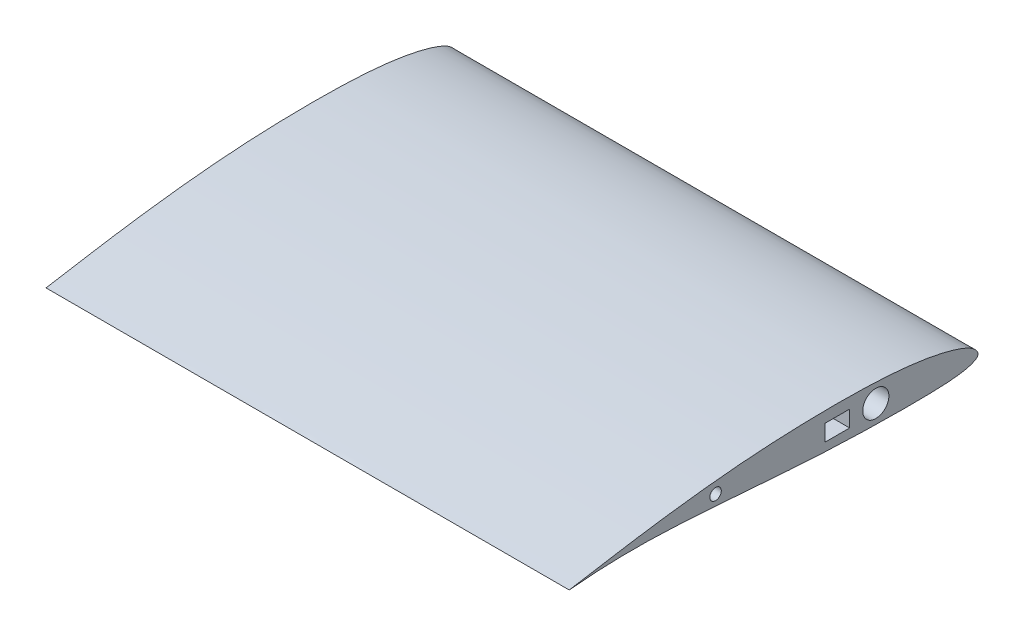
ISO-10303-21;
HEADER;
FILE_DESCRIPTION(('STEP AP214'),'2;1');
FILE_NAME('part.step','',(''),(''),'','','');
FILE_SCHEMA(('AUTOMOTIVE_DESIGN { 1 0 10303 214 1 1 1 1 }'));
ENDSEC;
DATA;
#1=APPLICATION_CONTEXT('core data for automotive mechanical design processes');
#2=APPLICATION_PROTOCOL_DEFINITION('international standard','automotive_design',2000,#1);
#3=PRODUCT_CONTEXT('',#1,'mechanical');
#4=PRODUCT('Part','Part','',(#3));
#5=PRODUCT_RELATED_PRODUCT_CATEGORY('part','',(#4));
#6=PRODUCT_DEFINITION_FORMATION('','',#4);
#7=PRODUCT_DEFINITION_CONTEXT('part definition',#1,'design');
#8=PRODUCT_DEFINITION('design','',#6,#7);
#9=PRODUCT_DEFINITION_SHAPE('','',#8);
#10=(LENGTH_UNIT() NAMED_UNIT(*) SI_UNIT(.MILLI.,.METRE.));
#11=(NAMED_UNIT(*) PLANE_ANGLE_UNIT() SI_UNIT($,.RADIAN.));
#12=(NAMED_UNIT(*) SI_UNIT($,.STERADIAN.) SOLID_ANGLE_UNIT());
#13=UNCERTAINTY_MEASURE_WITH_UNIT(LENGTH_MEASURE(1.E-05),#10,'distance_accuracy_value','');
#14=(GEOMETRIC_REPRESENTATION_CONTEXT(3) GLOBAL_UNCERTAINTY_ASSIGNED_CONTEXT((#13)) GLOBAL_UNIT_ASSIGNED_CONTEXT((#10,
#11,#12)) REPRESENTATION_CONTEXT('',''));
#15=CARTESIAN_POINT('',(0.,0.,0.));
#16=DIRECTION('',(0.,0.,1.));
#17=DIRECTION('',(1.,0.,0.));
#18=AXIS2_PLACEMENT_3D('',#15,#16,#17);
#19=CARTESIAN_POINT('',(320.,1.49711132773622,0.435092083404368));
#20=DIRECTION('',(-1.,0.,0.));
#21=DIRECTION('',(0.,0.,1.));
#22=AXIS2_PLACEMENT_3D('',#19,#20,#21);
#23=PLANE('',#22);
#24=CARTESIAN_POINT('',(320.,6.07732270373844,160.499919709394));
#25=DIRECTION('',(1.,0.,0.));
#26=DIRECTION('',(0.,0.,-1.));
#27=AXIS2_PLACEMENT_3D('',#24,#25,#26);
#28=CIRCLE('',#27,3.49999999999999);
#29=CARTESIAN_POINT('',(320.,6.07732270373844,156.999919709394));
#30=VERTEX_POINT('',#29);
#31=EDGE_CURVE('E148',#30,#30,#28,.T.);
#32=ORIENTED_EDGE('',*,*,#31,.F.);
#33=EDGE_LOOP('',(#32));
#34=FACE_BOUND('',#33,.T.);
#35=CARTESIAN_POINT('',(320.,5.07732270373844,62.4999197093942));
#36=DIRECTION('',(1.,0.,0.));
#37=DIRECTION('',(0.,0.,-1.));
#38=AXIS2_PLACEMENT_3D('',#35,#36,#37);
#39=CIRCLE('',#38,8.);
#40=CARTESIAN_POINT('',(320.,5.07732270373844,54.4999197093942));
#41=VERTEX_POINT('',#40);
#42=EDGE_CURVE('E113',#41,#41,#39,.T.);
#43=ORIENTED_EDGE('',*,*,#42,.F.);
#44=EDGE_LOOP('',(#43));
#45=FACE_BOUND('',#44,.T.);
#46=CARTESIAN_POINT('',(320.,0.,250.));
#47=CARTESIAN_POINT('',(320.,-0.0080427959719715,250.000228293678));
#48=CARTESIAN_POINT('',(320.,0.172375657967406,248.284955515532));
#49=CARTESIAN_POINT('',(320.,0.308690014795419,246.518112419387));
#50=CARTESIAN_POINT('',(320.,0.685693593852336,242.189387343398));
#51=CARTESIAN_POINT('',(320.,1.07410152891603,236.806461263496));
#52=CARTESIAN_POINT('',(320.,1.49731723995003,229.680385951639));
#53=CARTESIAN_POINT('',(320.,1.8232186026768,221.18415869828));
#54=CARTESIAN_POINT('',(320.,1.96762610068065,211.337618207726));
#55=CARTESIAN_POINT('',(320.,1.83322105638369,200.371188527109));
#56=CARTESIAN_POINT('',(320.,1.38960528984164,188.499913622482));
#57=CARTESIAN_POINT('',(320.,0.706014078000893,175.953687417433));
#58=CARTESIAN_POINT('',(320.,-0.160208641561513,162.931424917666));
#59=CARTESIAN_POINT('',(320.,-1.14801632724376,149.615771743617));
#60=CARTESIAN_POINT('',(320.,-2.19092490983926,136.176354994724));
#61=CARTESIAN_POINT('',(320.,-3.21958397917046,122.767140548026));
#62=CARTESIAN_POINT('',(320.,-4.15274312671142,109.520053587455));
#63=CARTESIAN_POINT('',(320.,-4.93856436487493,96.5460959745437));
#64=CARTESIAN_POINT('',(320.,-5.53683070268675,83.9408193016427));
#65=CARTESIAN_POINT('',(320.,-5.94764820461108,71.8018392906514));
#66=CARTESIAN_POINT('',(320.,-6.21845093878312,60.2452560030716));
#67=CARTESIAN_POINT('',(320.,-6.35536975583973,49.3987328907547));
#68=CARTESIAN_POINT('',(320.,-6.38138796281789,39.3972261942655));
#69=CARTESIAN_POINT('',(320.,-6.26504923032313,30.3619348419668));
#70=CARTESIAN_POINT('',(320.,-6.01216491688521,22.4121811031587));
#71=CARTESIAN_POINT('',(320.,-5.59743390072595,15.6262272306516));
#72=CARTESIAN_POINT('',(320.,-4.92870657935606,10.0719075109048));
#73=CARTESIAN_POINT('',(320.,-4.04044698146404,5.69769261214423));
#74=CARTESIAN_POINT('',(320.,-2.8657529844069,2.62532063874475));
#75=CARTESIAN_POINT('',(320.,-1.7115284699546,0.494884225045661));
#76=CARTESIAN_POINT('',(320.,-0.410454230626488,-0.0213125491030087));
#77=CARTESIAN_POINT('',(320.,0.792659826704065,0.0311691995850224));
#78=CARTESIAN_POINT('',(320.,2.30568433693192,0.812599241892923));
#79=CARTESIAN_POINT('',(320.,4.23835242447377,2.72886351673443));
#80=CARTESIAN_POINT('',(320.,6.11817212106947,5.76990724125498));
#81=CARTESIAN_POINT('',(320.,7.91359420170391,9.88094280419771));
#82=CARTESIAN_POINT('',(320.,9.64131817838287,15.0749304677094));
#83=CARTESIAN_POINT('',(320.,11.2838964878058,21.2987522216172));
#84=CARTESIAN_POINT('',(320.,12.7883817585812,28.4971721202648));
#85=CARTESIAN_POINT('',(320.,14.0978349081275,36.6073734062479));
#86=CARTESIAN_POINT('',(320.,15.1594290171638,45.573028440303));
#87=CARTESIAN_POINT('',(320.,15.9609039979753,55.3329100744701));
#88=CARTESIAN_POINT('',(320.,16.4940697383882,65.8165364983871));
#89=CARTESIAN_POINT('',(320.,16.7919897051422,76.9313762604552));
#90=CARTESIAN_POINT('',(320.,16.864754130909,88.5669490281142));
#91=CARTESIAN_POINT('',(320.,16.7267152914356,100.596999885542));
#92=CARTESIAN_POINT('',(320.,16.3833850637257,112.888825982424));
#93=CARTESIAN_POINT('',(320.,15.825573666627,125.31161581915));
#94=CARTESIAN_POINT('',(320.,15.0523318700684,137.743791097076));
#95=CARTESIAN_POINT('',(320.,14.0593390742259,150.072384382085));
#96=CARTESIAN_POINT('',(320.,12.8815869860292,162.191375055682));
#97=CARTESIAN_POINT('',(320.,11.5492803460744,173.989074322246));
#98=CARTESIAN_POINT('',(320.,10.1162497290333,185.35236444642));
#99=CARTESIAN_POINT('',(320.,8.63237912523508,196.163081697706));
#100=CARTESIAN_POINT('',(320.,7.13151388385034,206.300441402258));
#101=CARTESIAN_POINT('',(320.,5.73122176805054,215.560350587015));
#102=CARTESIAN_POINT('',(320.,4.29329512716244,223.97715704258));
#103=CARTESIAN_POINT('',(320.,3.1818088737293,231.363413336396));
#104=CARTESIAN_POINT('',(320.,2.09894241729889,237.746440904332));
#105=CARTESIAN_POINT('',(320.,1.2458619166603,242.622069365861));
#106=CARTESIAN_POINT('',(320.,0.552864946230777,246.64452933247));
#107=CARTESIAN_POINT('',(320.,0.246216764640028,248.328398440367));
#108=CARTESIAN_POINT('',(320.,0.00797737724443801,249.999773563223));
#109=CARTESIAN_POINT('',(320.,0.,250.));
#110=B_SPLINE_CURVE_WITH_KNOTS('',3,(#46,#47,#48,#49,#50,#51,#52,#53,#54,#55,#56,#57,#58,#59,
#60,#61,#62,#63,#64,#65,#66,#67,#68,#69,#70,#71,#72,#73,#74,#75,#76,#77,#78,#79,#80,#81,#82,#83,
#84,#85,#86,#87,#88,#89,#90,#91,#92,#93,#94,#95,#96,#97,#98,#99,#100,#101,#102,#103,#104,#105,
#106,#107,#108,#109),.UNSPECIFIED.,.T.,.F.,(4,1,1,1,1,1,1,1,1,1,1,1,1,1,1,1,1,1,1,1,1,1,1,1,1,1,
1,1,1,1,1,1,1,1,1,1,1,1,1,1,1,1,1,1,1,1,1,1,1,1,1,1,1,1,1,1,1,1,1,1,1,4),(0.,
0.00158888881614516,0.00632921783555629,0.0142024564897436,0.0251728077530557,
0.0391734833267743,0.0560606311759249,0.0755789238487882,0.0973636066296903,0.120926258366677,
0.145825281006277,0.171670911815127,0.198108536705041,0.22479018357162,0.25139057978404,
0.277643490654311,0.303326750051388,0.328257458029316,0.352272548115194,0.375156061746876,
0.396620664402003,0.416422729294005,0.434304420097656,0.450054679859308,0.463465465082325,
0.474478994238096,0.483169222153171,0.489678354497499,0.494104066315722,0.496910015324886,
0.497289784891853,0.501214273282496,0.506457950332762,0.51335695674223,0.522168631834455,
0.53296596992453,0.545689209241574,0.56022077890382,0.57643892310517,0.594258689005965,
0.613600244568652,0.634342385932902,0.656331109263004,0.679351893859712,0.703152302846811,
0.727478208080039,0.7520707394079,0.776691163534608,0.801140183976245,0.825214386971546,
0.848697423570622,0.871352857669295,0.892947448931157,0.913230871058069,0.931955467148994,
0.94834206907442,0.963693004275676,0.976235918239566,0.986320058750392,0.993788799349345,
0.998424034933867,1.),.UNSPECIFIED.);
#111=CARTESIAN_POINT('',(320.,0.,250.));
#112=VERTEX_POINT('',#111);
#113=EDGE_CURVE('E11',#112,#112,#110,.T.);
#114=ORIENTED_EDGE('',*,*,#113,.T.);
#115=EDGE_LOOP('',(#114));
#116=FACE_BOUND('',#115,.T.);
#117=DIRECTION('',(0.,-1.,0.));
#118=VECTOR('',#117,1.);
#119=CARTESIAN_POINT('',(320.,10.0773227037384,93.4999197093942));
#120=LINE('',#119,#118);
#121=CARTESIAN_POINT('',(320.,10.0773227037384,93.4999197093942));
#122=VERTEX_POINT('',#121);
#123=CARTESIAN_POINT('',(320.,0.0773227037384437,93.4999197093942));
#124=VERTEX_POINT('',#123);
#125=EDGE_CURVE('E75',#122,#124,#120,.T.);
#126=ORIENTED_EDGE('',*,*,#125,.F.);
#127=DIRECTION('',(0.,0.,1.));
#128=VECTOR('',#127,1.);
#129=CARTESIAN_POINT('',(320.,10.0773227037384,93.4999197093942));
#130=LINE('',#129,#128);
#131=CARTESIAN_POINT('',(320.,10.0773227037384,78.4999197093942));
#132=VERTEX_POINT('',#131);
#133=EDGE_CURVE('E97',#132,#122,#130,.T.);
#134=ORIENTED_EDGE('',*,*,#133,.F.);
#135=DIRECTION('',(0.,1.,0.));
#136=VECTOR('',#135,1.);
#137=CARTESIAN_POINT('',(320.,10.0773227037384,78.4999197093942));
#138=LINE('',#137,#136);
#139=CARTESIAN_POINT('',(320.,0.0773227037384437,78.4999197093942));
#140=VERTEX_POINT('',#139);
#141=EDGE_CURVE('E95',#140,#132,#138,.T.);
#142=ORIENTED_EDGE('',*,*,#141,.F.);
#143=DIRECTION('',(0.,0.,-1.));
#144=VECTOR('',#143,1.);
#145=CARTESIAN_POINT('',(320.,0.0773227037384437,93.4999197093942));
#146=LINE('',#145,#144);
#147=EDGE_CURVE('E83',#124,#140,#146,.T.);
#148=ORIENTED_EDGE('',*,*,#147,.F.);
#149=EDGE_LOOP('',(#126,#134,#142,#148));
#150=FACE_BOUND('',#149,.T.);
#151=ADVANCED_FACE('F32',(#34,#45,#116,#150),#23,.F.);
#152=CARTESIAN_POINT('',(0.,1.49711132773622,0.435092083404368));
#153=DIRECTION('',(-1.,0.,0.));
#154=DIRECTION('',(0.,0.,1.));
#155=AXIS2_PLACEMENT_3D('',#152,#153,#154);
#156=PLANE('',#155);
#157=CARTESIAN_POINT('',(0.,6.07732270373844,160.499919709394));
#158=DIRECTION('',(-1.,0.,0.));
#159=DIRECTION('',(0.,0.,1.));
#160=AXIS2_PLACEMENT_3D('',#157,#158,#159);
#161=CIRCLE('',#160,3.49999999999999);
#162=CARTESIAN_POINT('',(0.,6.07732270373844,163.999919709394));
#163=VERTEX_POINT('',#162);
#164=EDGE_CURVE('E160',#163,#163,#161,.T.);
#165=ORIENTED_EDGE('',*,*,#164,.F.);
#166=EDGE_LOOP('',(#165));
#167=FACE_BOUND('',#166,.T.);
#168=CARTESIAN_POINT('',(0.,0.,250.));
#169=CARTESIAN_POINT('',(0.,-0.0080427959719715,250.000228293678));
#170=CARTESIAN_POINT('',(0.,0.172375657967406,248.284955515532));
#171=CARTESIAN_POINT('',(0.,0.308690014795419,246.518112419387));
#172=CARTESIAN_POINT('',(0.,0.685693593852336,242.189387343398));
#173=CARTESIAN_POINT('',(0.,1.07410152891603,236.806461263496));
#174=CARTESIAN_POINT('',(0.,1.49731723995003,229.680385951639));
#175=CARTESIAN_POINT('',(0.,1.8232186026768,221.18415869828));
#176=CARTESIAN_POINT('',(0.,1.96762610068065,211.337618207726));
#177=CARTESIAN_POINT('',(0.,1.83322105638369,200.371188527109));
#178=CARTESIAN_POINT('',(0.,1.38960528984164,188.499913622482));
#179=CARTESIAN_POINT('',(0.,0.706014078000893,175.953687417433));
#180=CARTESIAN_POINT('',(0.,-0.160208641561513,162.931424917666));
#181=CARTESIAN_POINT('',(0.,-1.14801632724376,149.615771743617));
#182=CARTESIAN_POINT('',(0.,-2.19092490983926,136.176354994724));
#183=CARTESIAN_POINT('',(0.,-3.21958397917046,122.767140548026));
#184=CARTESIAN_POINT('',(0.,-4.15274312671142,109.520053587455));
#185=CARTESIAN_POINT('',(0.,-4.93856436487493,96.5460959745437));
#186=CARTESIAN_POINT('',(0.,-5.53683070268675,83.9408193016427));
#187=CARTESIAN_POINT('',(0.,-5.94764820461108,71.8018392906514));
#188=CARTESIAN_POINT('',(0.,-6.21845093878312,60.2452560030716));
#189=CARTESIAN_POINT('',(0.,-6.35536975583973,49.3987328907547));
#190=CARTESIAN_POINT('',(0.,-6.38138796281789,39.3972261942655));
#191=CARTESIAN_POINT('',(0.,-6.26504923032313,30.3619348419668));
#192=CARTESIAN_POINT('',(0.,-6.01216491688521,22.4121811031587));
#193=CARTESIAN_POINT('',(0.,-5.59743390072595,15.6262272306516));
#194=CARTESIAN_POINT('',(0.,-4.92870657935606,10.0719075109048));
#195=CARTESIAN_POINT('',(0.,-4.04044698146404,5.69769261214423));
#196=CARTESIAN_POINT('',(0.,-2.8657529844069,2.62532063874475));
#197=CARTESIAN_POINT('',(0.,-1.7115284699546,0.494884225045661));
#198=CARTESIAN_POINT('',(0.,-0.410454230626488,-0.0213125491030087));
#199=CARTESIAN_POINT('',(0.,0.792659826704065,0.0311691995850224));
#200=CARTESIAN_POINT('',(0.,2.30568433693192,0.812599241892923));
#201=CARTESIAN_POINT('',(0.,4.23835242447377,2.72886351673443));
#202=CARTESIAN_POINT('',(0.,6.11817212106947,5.76990724125498));
#203=CARTESIAN_POINT('',(0.,7.91359420170391,9.88094280419771));
#204=CARTESIAN_POINT('',(0.,9.64131817838287,15.0749304677094));
#205=CARTESIAN_POINT('',(0.,11.2838964878058,21.2987522216172));
#206=CARTESIAN_POINT('',(0.,12.7883817585812,28.4971721202648));
#207=CARTESIAN_POINT('',(0.,14.0978349081275,36.6073734062479));
#208=CARTESIAN_POINT('',(0.,15.1594290171638,45.573028440303));
#209=CARTESIAN_POINT('',(0.,15.9609039979753,55.3329100744701));
#210=CARTESIAN_POINT('',(0.,16.4940697383882,65.8165364983871));
#211=CARTESIAN_POINT('',(0.,16.7919897051422,76.9313762604552));
#212=CARTESIAN_POINT('',(0.,16.864754130909,88.5669490281142));
#213=CARTESIAN_POINT('',(0.,16.7267152914356,100.596999885542));
#214=CARTESIAN_POINT('',(0.,16.3833850637257,112.888825982424));
#215=CARTESIAN_POINT('',(0.,15.825573666627,125.31161581915));
#216=CARTESIAN_POINT('',(0.,15.0523318700684,137.743791097076));
#217=CARTESIAN_POINT('',(0.,14.0593390742259,150.072384382085));
#218=CARTESIAN_POINT('',(0.,12.8815869860292,162.191375055682));
#219=CARTESIAN_POINT('',(0.,11.5492803460744,173.989074322246));
#220=CARTESIAN_POINT('',(0.,10.1162497290333,185.35236444642));
#221=CARTESIAN_POINT('',(0.,8.63237912523508,196.163081697706));
#222=CARTESIAN_POINT('',(0.,7.13151388385034,206.300441402258));
#223=CARTESIAN_POINT('',(0.,5.73122176805054,215.560350587015));
#224=CARTESIAN_POINT('',(0.,4.29329512716244,223.97715704258));
#225=CARTESIAN_POINT('',(0.,3.1818088737293,231.363413336396));
#226=CARTESIAN_POINT('',(0.,2.09894241729889,237.746440904332));
#227=CARTESIAN_POINT('',(0.,1.2458619166603,242.622069365861));
#228=CARTESIAN_POINT('',(0.,0.552864946230777,246.64452933247));
#229=CARTESIAN_POINT('',(0.,0.246216764640028,248.328398440367));
#230=CARTESIAN_POINT('',(0.,0.00797737724443801,249.999773563223));
#231=CARTESIAN_POINT('',(0.,0.,250.));
#232=B_SPLINE_CURVE_WITH_KNOTS('',3,(#168,#169,#170,#171,#172,#173,#174,#175,#176,#177,#178,
#179,#180,#181,#182,#183,#184,#185,#186,#187,#188,#189,#190,#191,#192,#193,#194,#195,#196,#197,
#198,#199,#200,#201,#202,#203,#204,#205,#206,#207,#208,#209,#210,#211,#212,#213,#214,#215,#216,
#217,#218,#219,#220,#221,#222,#223,#224,#225,#226,#227,#228,#229,#230,#231),.UNSPECIFIED.,.T.,
.F.,(4,1,1,1,1,1,1,1,1,1,1,1,1,1,1,1,1,1,1,1,1,1,1,1,1,1,1,1,1,1,1,1,1,1,1,1,1,1,1,1,1,1,1,1,1,
1,1,1,1,1,1,1,1,1,1,1,1,1,1,1,1,4),(0.,0.00158888881614516,0.00632921783555629,
0.0142024564897436,0.0251728077530557,0.0391734833267743,0.0560606311759249,0.0755789238487882,
0.0973636066296903,0.120926258366677,0.145825281006277,0.171670911815127,0.198108536705041,
0.22479018357162,0.25139057978404,0.277643490654311,0.303326750051388,0.328257458029316,
0.352272548115194,0.375156061746876,0.396620664402003,0.416422729294005,0.434304420097656,
0.450054679859308,0.463465465082325,0.474478994238096,0.483169222153171,0.489678354497499,
0.494104066315722,0.496910015324886,0.497289784891853,0.501214273282496,0.506457950332762,
0.51335695674223,0.522168631834455,0.53296596992453,0.545689209241574,0.56022077890382,
0.57643892310517,0.594258689005965,0.613600244568652,0.634342385932902,0.656331109263004,
0.679351893859712,0.703152302846811,0.727478208080039,0.7520707394079,0.776691163534608,
0.801140183976245,0.825214386971546,0.848697423570622,0.871352857669295,0.892947448931157,
0.913230871058069,0.931955467148994,0.94834206907442,0.963693004275676,0.976235918239566,
0.986320058750392,0.993788799349345,0.998424034933867,1.),.UNSPECIFIED.);
#233=CARTESIAN_POINT('',(0.,0.,250.));
#234=VERTEX_POINT('',#233);
#235=EDGE_CURVE('E37',#234,#234,#232,.T.);
#236=ORIENTED_EDGE('',*,*,#235,.F.);
#237=EDGE_LOOP('',(#236));
#238=FACE_BOUND('',#237,.T.);
#239=CARTESIAN_POINT('',(0.,5.07732270373844,62.4999197093942));
#240=DIRECTION('',(1.,0.,0.));
#241=DIRECTION('',(0.,0.,-1.));
#242=AXIS2_PLACEMENT_3D('',#239,#240,#241);
#243=CIRCLE('',#242,8.);
#244=CARTESIAN_POINT('',(0.,5.07732270373844,54.4999197093942));
#245=VERTEX_POINT('',#244);
#246=EDGE_CURVE('E91',#245,#245,#243,.T.);
#247=ORIENTED_EDGE('',*,*,#246,.T.);
#248=EDGE_LOOP('',(#247));
#249=FACE_BOUND('',#248,.T.);
#250=DIRECTION('',(0.,0.,1.));
#251=VECTOR('',#250,1.);
#252=CARTESIAN_POINT('',(0.,10.0773227037384,93.4999197093942));
#253=LINE('',#252,#251);
#254=CARTESIAN_POINT('',(0.,10.0773227037384,78.4999197093942));
#255=VERTEX_POINT('',#254);
#256=CARTESIAN_POINT('',(0.,10.0773227037384,93.4999197093942));
#257=VERTEX_POINT('',#256);
#258=EDGE_CURVE('E84',#255,#257,#253,.T.);
#259=ORIENTED_EDGE('',*,*,#258,.T.);
#260=DIRECTION('',(0.,-1.,0.));
#261=VECTOR('',#260,1.);
#262=CARTESIAN_POINT('',(0.,10.0773227037384,93.4999197093942));
#263=LINE('',#262,#261);
#264=CARTESIAN_POINT('',(0.,0.0773227037384437,93.4999197093942));
#265=VERTEX_POINT('',#264);
#266=EDGE_CURVE('E57',#257,#265,#263,.T.);
#267=ORIENTED_EDGE('',*,*,#266,.T.);
#268=DIRECTION('',(0.,0.,-1.));
#269=VECTOR('',#268,1.);
#270=CARTESIAN_POINT('',(0.,0.0773227037384437,93.4999197093942));
#271=LINE('',#270,#269);
#272=CARTESIAN_POINT('',(0.,0.0773227037384437,78.4999197093942));
#273=VERTEX_POINT('',#272);
#274=EDGE_CURVE('E90',#265,#273,#271,.T.);
#275=ORIENTED_EDGE('',*,*,#274,.T.);
#276=DIRECTION('',(0.,1.,0.));
#277=VECTOR('',#276,1.);
#278=CARTESIAN_POINT('',(0.,10.0773227037384,78.4999197093942));
#279=LINE('',#278,#277);
#280=EDGE_CURVE('E105',#273,#255,#279,.T.);
#281=ORIENTED_EDGE('',*,*,#280,.T.);
#282=EDGE_LOOP('',(#259,#267,#275,#281));
#283=FACE_BOUND('',#282,.T.);
#284=ADVANCED_FACE('F125',(#167,#238,#249,#283),#156,.T.);
#285=DIRECTION('',(-1.,0.,0.));
#286=VECTOR('',#285,1.);
#287=SURFACE_OF_LINEAR_EXTRUSION('',#110,#286);
#288=ORIENTED_EDGE('',*,*,#113,.F.);
#289=EDGE_LOOP('',(#288));
#290=FACE_BOUND('',#289,.T.);
#291=ORIENTED_EDGE('',*,*,#235,.T.);
#292=EDGE_LOOP('',(#291));
#293=FACE_BOUND('',#292,.T.);
#294=ADVANCED_FACE('F34',(#290,#293),#287,.F.);
#295=CARTESIAN_POINT('',(320.,5.07732270373844,62.4999197093942));
#296=DIRECTION('',(-1.,0.,0.));
#297=DIRECTION('',(0.,0.,1.));
#298=AXIS2_PLACEMENT_3D('',#295,#296,#297);
#299=CYLINDRICAL_SURFACE('',#298,8.);
#300=ORIENTED_EDGE('',*,*,#42,.T.);
#301=EDGE_LOOP('',(#300));
#302=FACE_BOUND('',#301,.T.);
#303=ORIENTED_EDGE('',*,*,#246,.F.);
#304=EDGE_LOOP('',(#303));
#305=FACE_BOUND('',#304,.T.);
#306=ADVANCED_FACE('F128',(#302,#305),#299,.F.);
#307=CARTESIAN_POINT('',(320.,10.0773227037384,93.4999197093942));
#308=DIRECTION('',(0.,0.,-1.));
#309=DIRECTION('',(-1.,0.,0.));
#310=AXIS2_PLACEMENT_3D('',#307,#308,#309);
#311=PLANE('',#310);
#312=ORIENTED_EDGE('',*,*,#266,.F.);
#313=DIRECTION('',(-1.,0.,0.));
#314=VECTOR('',#313,1.);
#315=CARTESIAN_POINT('',(320.,10.0773227037384,93.4999197093942));
#316=LINE('',#315,#314);
#317=EDGE_CURVE('E79',#122,#257,#316,.T.);
#318=ORIENTED_EDGE('',*,*,#317,.F.);
#319=ORIENTED_EDGE('',*,*,#125,.T.);
#320=DIRECTION('',(-1.,0.,0.));
#321=VECTOR('',#320,1.);
#322=CARTESIAN_POINT('',(320.,0.0773227037384437,93.4999197093942));
#323=LINE('',#322,#321);
#324=EDGE_CURVE('E78',#124,#265,#323,.T.);
#325=ORIENTED_EDGE('',*,*,#324,.T.);
#326=EDGE_LOOP('',(#312,#318,#319,#325));
#327=FACE_BOUND('',#326,.T.);
#328=ADVANCED_FACE('F77',(#327),#311,.T.);
#329=CARTESIAN_POINT('',(320.,0.0773227037384437,93.4999197093942));
#330=DIRECTION('',(0.,1.,0.));
#331=DIRECTION('',(0.,0.,1.));
#332=AXIS2_PLACEMENT_3D('',#329,#330,#331);
#333=PLANE('',#332);
#334=ORIENTED_EDGE('',*,*,#274,.F.);
#335=ORIENTED_EDGE('',*,*,#324,.F.);
#336=ORIENTED_EDGE('',*,*,#147,.T.);
#337=DIRECTION('',(-1.,0.,0.));
#338=VECTOR('',#337,1.);
#339=CARTESIAN_POINT('',(320.,0.0773227037384437,78.4999197093942));
#340=LINE('',#339,#338);
#341=EDGE_CURVE('E92',#140,#273,#340,.T.);
#342=ORIENTED_EDGE('',*,*,#341,.T.);
#343=EDGE_LOOP('',(#334,#335,#336,#342));
#344=FACE_BOUND('',#343,.T.);
#345=ADVANCED_FACE('F87',(#344),#333,.T.);
#346=CARTESIAN_POINT('',(320.,10.0773227037384,78.4999197093942));
#347=DIRECTION('',(0.,0.,1.));
#348=DIRECTION('',(1.,0.,0.));
#349=AXIS2_PLACEMENT_3D('',#346,#347,#348);
#350=PLANE('',#349);
#351=ORIENTED_EDGE('',*,*,#280,.F.);
#352=ORIENTED_EDGE('',*,*,#341,.F.);
#353=ORIENTED_EDGE('',*,*,#141,.T.);
#354=DIRECTION('',(-1.,0.,0.));
#355=VECTOR('',#354,1.);
#356=CARTESIAN_POINT('',(320.,10.0773227037384,78.4999197093942));
#357=LINE('',#356,#355);
#358=EDGE_CURVE('E49',#132,#255,#357,.T.);
#359=ORIENTED_EDGE('',*,*,#358,.T.);
#360=EDGE_LOOP('',(#351,#352,#353,#359));
#361=FACE_BOUND('',#360,.T.);
#362=ADVANCED_FACE('F180',(#361),#350,.T.);
#363=CARTESIAN_POINT('',(320.,10.0773227037384,93.4999197093942));
#364=DIRECTION('',(0.,-1.,0.));
#365=DIRECTION('',(0.,0.,-1.));
#366=AXIS2_PLACEMENT_3D('',#363,#364,#365);
#367=PLANE('',#366);
#368=ORIENTED_EDGE('',*,*,#258,.F.);
#369=ORIENTED_EDGE('',*,*,#358,.F.);
#370=ORIENTED_EDGE('',*,*,#133,.T.);
#371=ORIENTED_EDGE('',*,*,#317,.T.);
#372=EDGE_LOOP('',(#368,#369,#370,#371));
#373=FACE_BOUND('',#372,.T.);
#374=ADVANCED_FACE('F170',(#373),#367,.T.);
#375=CARTESIAN_POINT('',(15.,6.07732270373844,160.499919709394));
#376=DIRECTION('',(-1.,0.,0.));
#377=DIRECTION('',(0.,0.,1.));
#378=AXIS2_PLACEMENT_3D('',#375,#376,#377);
#379=CYLINDRICAL_SURFACE('',#378,3.49999999999999);
#380=CARTESIAN_POINT('',(15.,6.07732270373844,160.499919709394));
#381=DIRECTION('',(-1.,0.,0.));
#382=DIRECTION('',(0.,0.,1.));
#383=AXIS2_PLACEMENT_3D('',#380,#381,#382);
#384=CIRCLE('',#383,3.49999999999999);
#385=CARTESIAN_POINT('',(15.,6.07732270373844,163.999919709394));
#386=VERTEX_POINT('',#385);
#387=EDGE_CURVE('E103',#386,#386,#384,.T.);
#388=ORIENTED_EDGE('',*,*,#387,.F.);
#389=EDGE_LOOP('',(#388));
#390=FACE_BOUND('',#389,.T.);
#391=ORIENTED_EDGE('',*,*,#164,.T.);
#392=EDGE_LOOP('',(#391));
#393=FACE_BOUND('',#392,.T.);
#394=ADVANCED_FACE('F167',(#390,#393),#379,.F.);
#395=CARTESIAN_POINT('',(15.,6.07732270373844,160.499919709394));
#396=DIRECTION('',(-1.,0.,0.));
#397=DIRECTION('',(0.,0.,1.));
#398=AXIS2_PLACEMENT_3D('',#395,#396,#397);
#399=PLANE('',#398);
#400=ORIENTED_EDGE('',*,*,#387,.T.);
#401=EDGE_LOOP('',(#400));
#402=FACE_BOUND('',#401,.T.);
#403=ADVANCED_FACE('F169',(#402),#399,.T.);
#404=CARTESIAN_POINT('',(305.,6.07732270373844,160.499919709394));
#405=DIRECTION('',(1.,0.,0.));
#406=DIRECTION('',(0.,0.,-1.));
#407=AXIS2_PLACEMENT_3D('',#404,#405,#406);
#408=CYLINDRICAL_SURFACE('',#407,3.49999999999999);
#409=CARTESIAN_POINT('',(305.,6.07732270373844,160.499919709394));
#410=DIRECTION('',(1.,0.,0.));
#411=DIRECTION('',(0.,0.,-1.));
#412=AXIS2_PLACEMENT_3D('',#409,#410,#411);
#413=CIRCLE('',#412,3.49999999999999);
#414=CARTESIAN_POINT('',(305.,6.07732270373844,156.999919709394));
#415=VERTEX_POINT('',#414);
#416=EDGE_CURVE('E157',#415,#415,#413,.T.);
#417=ORIENTED_EDGE('',*,*,#416,.F.);
#418=EDGE_LOOP('',(#417));
#419=FACE_BOUND('',#418,.T.);
#420=ORIENTED_EDGE('',*,*,#31,.T.);
#421=EDGE_LOOP('',(#420));
#422=FACE_BOUND('',#421,.T.);
#423=ADVANCED_FACE('F177',(#419,#422),#408,.F.);
#424=CARTESIAN_POINT('',(305.,6.07732270373844,160.499919709394));
#425=DIRECTION('',(1.,0.,0.));
#426=DIRECTION('',(0.,0.,-1.));
#427=AXIS2_PLACEMENT_3D('',#424,#425,#426);
#428=PLANE('',#427);
#429=ORIENTED_EDGE('',*,*,#416,.T.);
#430=EDGE_LOOP('',(#429));
#431=FACE_BOUND('',#430,.T.);
#432=ADVANCED_FACE('F231',(#431),#428,.T.);
#433=CLOSED_SHELL('',(#151,#284,#294,#306,#328,#345,#362,#374,#394,#403,#423,#432));
#434=MANIFOLD_SOLID_BREP('B2',#433);
#435=ADVANCED_BREP_SHAPE_REPRESENTATION('',(#18,#434),#14);
#436=SHAPE_DEFINITION_REPRESENTATION(#9,#435);
ENDSEC;
END-ISO-10303-21;
